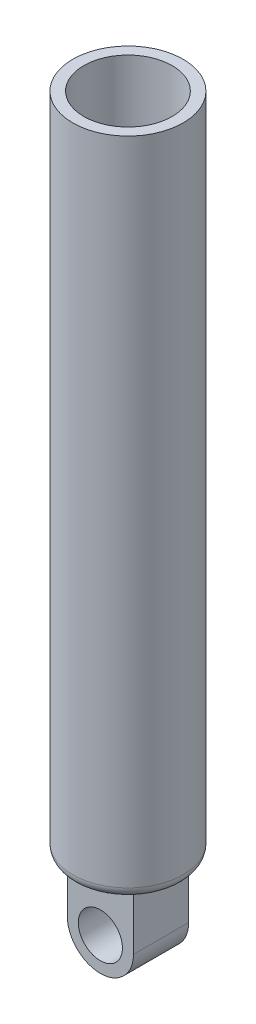
ISO-10303-21;
HEADER;
FILE_DESCRIPTION(('STEP AP214'),'2;1');
FILE_NAME('part.step','',(''),(''),'','','');
FILE_SCHEMA(('AUTOMOTIVE_DESIGN { 1 0 10303 214 1 1 1 1 }'));
ENDSEC;
DATA;
#1=APPLICATION_CONTEXT('core data for automotive mechanical design processes');
#2=APPLICATION_PROTOCOL_DEFINITION('international standard','automotive_design',2000,#1);
#3=PRODUCT_CONTEXT('',#1,'mechanical');
#4=PRODUCT('Part','Part','',(#3));
#5=PRODUCT_RELATED_PRODUCT_CATEGORY('part','',(#4));
#6=PRODUCT_DEFINITION_FORMATION('','',#4);
#7=PRODUCT_DEFINITION_CONTEXT('part definition',#1,'design');
#8=PRODUCT_DEFINITION('design','',#6,#7);
#9=PRODUCT_DEFINITION_SHAPE('','',#8);
#10=(LENGTH_UNIT() NAMED_UNIT(*) SI_UNIT(.MILLI.,.METRE.));
#11=(NAMED_UNIT(*) PLANE_ANGLE_UNIT() SI_UNIT($,.RADIAN.));
#12=(NAMED_UNIT(*) SI_UNIT($,.STERADIAN.) SOLID_ANGLE_UNIT());
#13=UNCERTAINTY_MEASURE_WITH_UNIT(LENGTH_MEASURE(1.E-05),#10,'distance_accuracy_value','');
#14=(GEOMETRIC_REPRESENTATION_CONTEXT(3) GLOBAL_UNCERTAINTY_ASSIGNED_CONTEXT((#13)) GLOBAL_UNIT_ASSIGNED_CONTEXT((#10,
#11,#12)) REPRESENTATION_CONTEXT('',''));
#15=CARTESIAN_POINT('',(0.,0.,0.));
#16=DIRECTION('',(0.,0.,1.));
#17=DIRECTION('',(1.,0.,0.));
#18=AXIS2_PLACEMENT_3D('',#15,#16,#17);
#19=CARTESIAN_POINT('',(0.,0.,0.));
#20=DIRECTION('',(0.,1.,0.));
#21=DIRECTION('',(0.,0.,1.));
#22=AXIS2_PLACEMENT_3D('',#19,#20,#21);
#23=PLANE('',#22);
#24=CARTESIAN_POINT('',(0.,0.,0.));
#25=DIRECTION('',(0.,1.,0.));
#26=DIRECTION('',(0.,0.,1.));
#27=AXIS2_PLACEMENT_3D('',#24,#25,#26);
#28=CIRCLE('',#27,20.);
#29=CARTESIAN_POINT('',(0.,0.,20.));
#30=VERTEX_POINT('',#29);
#31=EDGE_CURVE('E147',#30,#30,#28,.F.);
#32=ORIENTED_EDGE('',*,*,#31,.T.);
#33=EDGE_LOOP('',(#32));
#34=FACE_BOUND('',#33,.T.);
#35=DIRECTION('',(0.,0.,1.));
#36=VECTOR('',#35,1.);
#37=CARTESIAN_POINT('',(15.,0.,-12.5));
#38=LINE('',#37,#36);
#39=CARTESIAN_POINT('',(15.,0.,-12.5));
#40=VERTEX_POINT('',#39);
#41=CARTESIAN_POINT('',(15.,0.,12.5));
#42=VERTEX_POINT('',#41);
#43=EDGE_CURVE('E95',#40,#42,#38,.T.);
#44=ORIENTED_EDGE('',*,*,#43,.F.);
#45=DIRECTION('',(1.,0.,0.));
#46=VECTOR('',#45,1.);
#47=CARTESIAN_POINT('',(-15.,0.,-12.5));
#48=LINE('',#47,#46);
#49=CARTESIAN_POINT('',(-15.,0.,-12.5));
#50=VERTEX_POINT('',#49);
#51=EDGE_CURVE('E102',#50,#40,#48,.T.);
#52=ORIENTED_EDGE('',*,*,#51,.F.);
#53=DIRECTION('',(0.,0.,-1.));
#54=VECTOR('',#53,1.);
#55=CARTESIAN_POINT('',(-15.,0.,-12.5));
#56=LINE('',#55,#54);
#57=CARTESIAN_POINT('',(-15.,0.,12.5));
#58=VERTEX_POINT('',#57);
#59=EDGE_CURVE('E117',#58,#50,#56,.T.);
#60=ORIENTED_EDGE('',*,*,#59,.F.);
#61=DIRECTION('',(-1.,0.,0.));
#62=VECTOR('',#61,1.);
#63=CARTESIAN_POINT('',(-15.,0.,12.5));
#64=LINE('',#63,#62);
#65=EDGE_CURVE('E110',#42,#58,#64,.T.);
#66=ORIENTED_EDGE('',*,*,#65,.F.);
#67=EDGE_LOOP('',(#44,#52,#60,#66));
#68=FACE_BOUND('',#67,.T.);
#69=ADVANCED_FACE('F47',(#34,#68),#23,.F.);
#70=CARTESIAN_POINT('',(0.,300.,0.));
#71=DIRECTION('',(0.,-1.,0.));
#72=DIRECTION('',(0.,0.,-1.));
#73=AXIS2_PLACEMENT_3D('',#70,#71,#72);
#74=CYLINDRICAL_SURFACE('',#73,25.);
#75=CARTESIAN_POINT('',(0.,5.,0.));
#76=DIRECTION('',(0.,1.,0.));
#77=DIRECTION('',(0.,0.,1.));
#78=AXIS2_PLACEMENT_3D('',#75,#76,#77);
#79=CIRCLE('',#78,25.);
#80=CARTESIAN_POINT('',(0.,5.,25.));
#81=VERTEX_POINT('',#80);
#82=EDGE_CURVE('E143',#81,#81,#79,.T.);
#83=ORIENTED_EDGE('',*,*,#82,.T.);
#84=EDGE_LOOP('',(#83));
#85=FACE_BOUND('',#84,.T.);
#86=CARTESIAN_POINT('',(0.,300.,0.));
#87=DIRECTION('',(0.,1.,0.));
#88=DIRECTION('',(0.,0.,1.));
#89=AXIS2_PLACEMENT_3D('',#86,#87,#88);
#90=CIRCLE('',#89,25.);
#91=CARTESIAN_POINT('',(0.,300.,25.));
#92=VERTEX_POINT('',#91);
#93=EDGE_CURVE('E139',#92,#92,#90,.T.);
#94=ORIENTED_EDGE('',*,*,#93,.F.);
#95=EDGE_LOOP('',(#94));
#96=FACE_BOUND('',#95,.T.);
#97=ADVANCED_FACE('F194',(#85,#96),#74,.T.);
#98=CARTESIAN_POINT('',(0.,300.,0.));
#99=DIRECTION('',(0.,1.,0.));
#100=DIRECTION('',(0.,0.,1.));
#101=AXIS2_PLACEMENT_3D('',#98,#99,#100);
#102=PLANE('',#101);
#103=CARTESIAN_POINT('',(0.,300.,0.));
#104=DIRECTION('',(0.,1.,0.));
#105=DIRECTION('',(0.,0.,1.));
#106=AXIS2_PLACEMENT_3D('',#103,#104,#105);
#107=CIRCLE('',#106,20.);
#108=CARTESIAN_POINT('',(0.,300.,20.));
#109=VERTEX_POINT('',#108);
#110=EDGE_CURVE('E135',#109,#109,#107,.T.);
#111=ORIENTED_EDGE('',*,*,#110,.F.);
#112=EDGE_LOOP('',(#111));
#113=FACE_BOUND('',#112,.T.);
#114=ORIENTED_EDGE('',*,*,#93,.T.);
#115=EDGE_LOOP('',(#114));
#116=FACE_BOUND('',#115,.T.);
#117=ADVANCED_FACE('F201',(#113,#116),#102,.T.);
#118=CARTESIAN_POINT('',(0.,300.,0.));
#119=DIRECTION('',(0.,-1.,0.));
#120=DIRECTION('',(0.,0.,-1.));
#121=AXIS2_PLACEMENT_3D('',#118,#119,#120);
#122=CYLINDRICAL_SURFACE('',#121,20.);
#123=ORIENTED_EDGE('',*,*,#110,.T.);
#124=EDGE_LOOP('',(#123));
#125=FACE_BOUND('',#124,.T.);
#126=CARTESIAN_POINT('',(0.,5.,0.));
#127=DIRECTION('',(0.,1.,0.));
#128=DIRECTION('',(0.,0.,1.));
#129=AXIS2_PLACEMENT_3D('',#126,#127,#128);
#130=CIRCLE('',#129,20.);
#131=CARTESIAN_POINT('',(0.,5.,20.));
#132=VERTEX_POINT('',#131);
#133=EDGE_CURVE('E131',#132,#132,#130,.T.);
#134=ORIENTED_EDGE('',*,*,#133,.F.);
#135=EDGE_LOOP('',(#134));
#136=FACE_BOUND('',#135,.T.);
#137=ADVANCED_FACE('F217',(#125,#136),#122,.F.);
#138=CARTESIAN_POINT('',(0.,5.,0.));
#139=DIRECTION('',(0.,1.,0.));
#140=DIRECTION('',(0.,0.,1.));
#141=AXIS2_PLACEMENT_3D('',#138,#139,#140);
#142=PLANE('',#141);
#143=ORIENTED_EDGE('',*,*,#133,.T.);
#144=EDGE_LOOP('',(#143));
#145=FACE_BOUND('',#144,.T.);
#146=ADVANCED_FACE('F209',(#145),#142,.T.);
#147=CARTESIAN_POINT('',(0.,5.,0.));
#148=DIRECTION('',(0.,1.,0.));
#149=DIRECTION('',(0.,0.,1.));
#150=AXIS2_PLACEMENT_3D('',#147,#148,#149);
#151=TOROIDAL_SURFACE('',#150,20.,5.);
#152=ORIENTED_EDGE('',*,*,#31,.F.);
#153=EDGE_LOOP('',(#152));
#154=FACE_BOUND('',#153,.T.);
#155=ORIENTED_EDGE('',*,*,#82,.F.);
#156=EDGE_LOOP('',(#155));
#157=FACE_BOUND('',#156,.T.);
#158=ADVANCED_FACE('F207',(#154,#157),#151,.T.);
#159=CARTESIAN_POINT('',(15.,-40.,-12.5));
#160=DIRECTION('',(-1.,0.,0.));
#161=DIRECTION('',(0.,0.,1.));
#162=AXIS2_PLACEMENT_3D('',#159,#160,#161);
#163=PLANE('',#162);
#164=DIRECTION('',(0.,1.,0.));
#165=VECTOR('',#164,1.);
#166=CARTESIAN_POINT('',(15.,-40.,12.5));
#167=LINE('',#166,#165);
#168=CARTESIAN_POINT('',(15.,-25.,12.5));
#169=VERTEX_POINT('',#168);
#170=EDGE_CURVE('E128',#169,#42,#167,.T.);
#171=ORIENTED_EDGE('',*,*,#170,.F.);
#172=DIRECTION('',(0.,0.,1.));
#173=VECTOR('',#172,1.);
#174=CARTESIAN_POINT('',(15.,-25.,-12.5));
#175=LINE('',#174,#173);
#176=CARTESIAN_POINT('',(15.,-25.,-12.5));
#177=VERTEX_POINT('',#176);
#178=EDGE_CURVE('E11',#169,#177,#175,.F.);
#179=ORIENTED_EDGE('',*,*,#178,.T.);
#180=DIRECTION('',(0.,1.,0.));
#181=VECTOR('',#180,1.);
#182=CARTESIAN_POINT('',(15.,-40.,-12.5));
#183=LINE('',#182,#181);
#184=EDGE_CURVE('E92',#177,#40,#183,.T.);
#185=ORIENTED_EDGE('',*,*,#184,.T.);
#186=ORIENTED_EDGE('',*,*,#43,.T.);
#187=EDGE_LOOP('',(#171,#179,#185,#186));
#188=FACE_BOUND('',#187,.T.);
#189=ADVANCED_FACE('F94',(#188),#163,.F.);
#190=CARTESIAN_POINT('',(-15.,-40.,12.5));
#191=DIRECTION('',(0.,0.,-1.));
#192=DIRECTION('',(-1.,0.,0.));
#193=AXIS2_PLACEMENT_3D('',#190,#191,#192);
#194=PLANE('',#193);
#195=CARTESIAN_POINT('',(0.,-25.,12.5));
#196=DIRECTION('',(0.,0.,-1.));
#197=DIRECTION('',(-1.,0.,0.));
#198=AXIS2_PLACEMENT_3D('',#195,#196,#197);
#199=CIRCLE('',#198,10.);
#200=CARTESIAN_POINT('',(-10.,-25.,12.5));
#201=VERTEX_POINT('',#200);
#202=EDGE_CURVE('E112',#201,#201,#199,.T.);
#203=ORIENTED_EDGE('',*,*,#202,.T.);
#204=EDGE_LOOP('',(#203));
#205=FACE_BOUND('',#204,.T.);
#206=DIRECTION('',(0.,1.,0.));
#207=VECTOR('',#206,1.);
#208=CARTESIAN_POINT('',(-15.,-40.,12.5));
#209=LINE('',#208,#207);
#210=CARTESIAN_POINT('',(-15.,-25.,12.5));
#211=VERTEX_POINT('',#210);
#212=EDGE_CURVE('E125',#211,#58,#209,.T.);
#213=ORIENTED_EDGE('',*,*,#212,.F.);
#214=CARTESIAN_POINT('',(0.,-25.,12.5));
#215=DIRECTION('',(0.,0.,-1.));
#216=DIRECTION('',(-1.,0.,0.));
#217=AXIS2_PLACEMENT_3D('',#214,#215,#216);
#218=CIRCLE('',#217,15.);
#219=CARTESIAN_POINT('',(0.,-40.,12.5));
#220=VERTEX_POINT('',#219);
#221=EDGE_CURVE('E57',#211,#220,#218,.F.);
#222=ORIENTED_EDGE('',*,*,#221,.T.);
#223=CARTESIAN_POINT('',(0.,-25.,12.5));
#224=DIRECTION('',(0.,0.,-1.));
#225=DIRECTION('',(-1.,0.,0.));
#226=AXIS2_PLACEMENT_3D('',#223,#224,#225);
#227=CIRCLE('',#226,15.);
#228=EDGE_CURVE('E64',#220,#169,#227,.F.);
#229=ORIENTED_EDGE('',*,*,#228,.T.);
#230=ORIENTED_EDGE('',*,*,#170,.T.);
#231=ORIENTED_EDGE('',*,*,#65,.T.);
#232=EDGE_LOOP('',(#213,#222,#229,#230,#231));
#233=FACE_BOUND('',#232,.T.);
#234=ADVANCED_FACE('F169',(#205,#233),#194,.F.);
#235=CARTESIAN_POINT('',(-15.,-40.,-12.5));
#236=DIRECTION('',(1.,0.,0.));
#237=DIRECTION('',(0.,0.,-1.));
#238=AXIS2_PLACEMENT_3D('',#235,#236,#237);
#239=PLANE('',#238);
#240=DIRECTION('',(0.,1.,0.));
#241=VECTOR('',#240,1.);
#242=CARTESIAN_POINT('',(-15.,-40.,-12.5));
#243=LINE('',#242,#241);
#244=CARTESIAN_POINT('',(-15.,-25.,-12.5));
#245=VERTEX_POINT('',#244);
#246=EDGE_CURVE('E101',#245,#50,#243,.T.);
#247=ORIENTED_EDGE('',*,*,#246,.F.);
#248=DIRECTION('',(0.,0.,-1.));
#249=VECTOR('',#248,1.);
#250=CARTESIAN_POINT('',(-15.,-25.,-12.5));
#251=LINE('',#250,#249);
#252=EDGE_CURVE('E157',#245,#211,#251,.F.);
#253=ORIENTED_EDGE('',*,*,#252,.T.);
#254=ORIENTED_EDGE('',*,*,#212,.T.);
#255=ORIENTED_EDGE('',*,*,#59,.T.);
#256=EDGE_LOOP('',(#247,#253,#254,#255));
#257=FACE_BOUND('',#256,.T.);
#258=ADVANCED_FACE('F166',(#257),#239,.F.);
#259=CARTESIAN_POINT('',(-15.,-40.,-12.5));
#260=DIRECTION('',(0.,0.,1.));
#261=DIRECTION('',(1.,0.,0.));
#262=AXIS2_PLACEMENT_3D('',#259,#260,#261);
#263=PLANE('',#262);
#264=CARTESIAN_POINT('',(0.,-25.,-12.5));
#265=DIRECTION('',(0.,0.,-1.));
#266=DIRECTION('',(-1.,0.,0.));
#267=AXIS2_PLACEMENT_3D('',#264,#265,#266);
#268=CIRCLE('',#267,10.);
#269=CARTESIAN_POINT('',(-10.,-25.,-12.5));
#270=VERTEX_POINT('',#269);
#271=EDGE_CURVE('E175',#270,#270,#268,.T.);
#272=ORIENTED_EDGE('',*,*,#271,.F.);
#273=EDGE_LOOP('',(#272));
#274=FACE_BOUND('',#273,.T.);
#275=CARTESIAN_POINT('',(0.,-25.,-12.5));
#276=DIRECTION('',(0.,0.,1.));
#277=DIRECTION('',(1.,0.,0.));
#278=AXIS2_PLACEMENT_3D('',#275,#276,#277);
#279=CIRCLE('',#278,15.);
#280=CARTESIAN_POINT('',(0.,-40.,-12.5));
#281=VERTEX_POINT('',#280);
#282=EDGE_CURVE('E151',#177,#281,#279,.F.);
#283=ORIENTED_EDGE('',*,*,#282,.T.);
#284=CARTESIAN_POINT('',(0.,-25.,-12.5));
#285=DIRECTION('',(0.,0.,1.));
#286=DIRECTION('',(1.,0.,0.));
#287=AXIS2_PLACEMENT_3D('',#284,#285,#286);
#288=CIRCLE('',#287,15.);
#289=EDGE_CURVE('E154',#281,#245,#288,.F.);
#290=ORIENTED_EDGE('',*,*,#289,.T.);
#291=ORIENTED_EDGE('',*,*,#246,.T.);
#292=ORIENTED_EDGE('',*,*,#51,.T.);
#293=ORIENTED_EDGE('',*,*,#184,.F.);
#294=EDGE_LOOP('',(#283,#290,#291,#292,#293));
#295=FACE_BOUND('',#294,.T.);
#296=ADVANCED_FACE('F114',(#274,#295),#263,.F.);
#297=CARTESIAN_POINT('',(0.,-25.,27.5));
#298=DIRECTION('',(0.,0.,-1.));
#299=DIRECTION('',(-1.,0.,0.));
#300=AXIS2_PLACEMENT_3D('',#297,#298,#299);
#301=CYLINDRICAL_SURFACE('',#300,10.);
#302=ORIENTED_EDGE('',*,*,#271,.T.);
#303=EDGE_LOOP('',(#302));
#304=FACE_BOUND('',#303,.T.);
#305=ORIENTED_EDGE('',*,*,#202,.F.);
#306=EDGE_LOOP('',(#305));
#307=FACE_BOUND('',#306,.T.);
#308=ADVANCED_FACE('F186',(#304,#307),#301,.F.);
#309=CARTESIAN_POINT('',(0.,-25.,0.));
#310=DIRECTION('',(0.,0.,1.));
#311=DIRECTION('',(1.,0.,0.));
#312=AXIS2_PLACEMENT_3D('',#309,#310,#311);
#313=CYLINDRICAL_SURFACE('',#312,15.);
#314=ORIENTED_EDGE('',*,*,#178,.F.);
#315=ORIENTED_EDGE('',*,*,#228,.F.);
#316=DIRECTION('',(0.,0.,1.));
#317=VECTOR('',#316,1.);
#318=CARTESIAN_POINT('',(0.,-40.,0.));
#319=LINE('',#318,#317);
#320=EDGE_CURVE('E51',#281,#220,#319,.T.);
#321=ORIENTED_EDGE('',*,*,#320,.F.);
#322=ORIENTED_EDGE('',*,*,#282,.F.);
#323=EDGE_LOOP('',(#314,#315,#321,#322));
#324=FACE_BOUND('',#323,.T.);
#325=ADVANCED_FACE('F49',(#324),#313,.T.);
#326=CARTESIAN_POINT('',(0.,-25.,0.));
#327=DIRECTION('',(0.,0.,-1.));
#328=DIRECTION('',(-1.,0.,0.));
#329=AXIS2_PLACEMENT_3D('',#326,#327,#328);
#330=CYLINDRICAL_SURFACE('',#329,15.);
#331=ORIENTED_EDGE('',*,*,#221,.F.);
#332=ORIENTED_EDGE('',*,*,#252,.F.);
#333=ORIENTED_EDGE('',*,*,#289,.F.);
#334=ORIENTED_EDGE('',*,*,#320,.T.);
#335=EDGE_LOOP('',(#331,#332,#333,#334));
#336=FACE_BOUND('',#335,.T.);
#337=ADVANCED_FACE('F183',(#336),#330,.T.);
#338=CLOSED_SHELL('',(#69,#97,#117,#137,#146,#158,#189,#234,#258,#296,#308,#325,#337));
#339=MANIFOLD_SOLID_BREP('B2',#338);
#340=ADVANCED_BREP_SHAPE_REPRESENTATION('',(#18,#339),#14);
#341=SHAPE_DEFINITION_REPRESENTATION(#9,#340);
ENDSEC;
END-ISO-10303-21;
